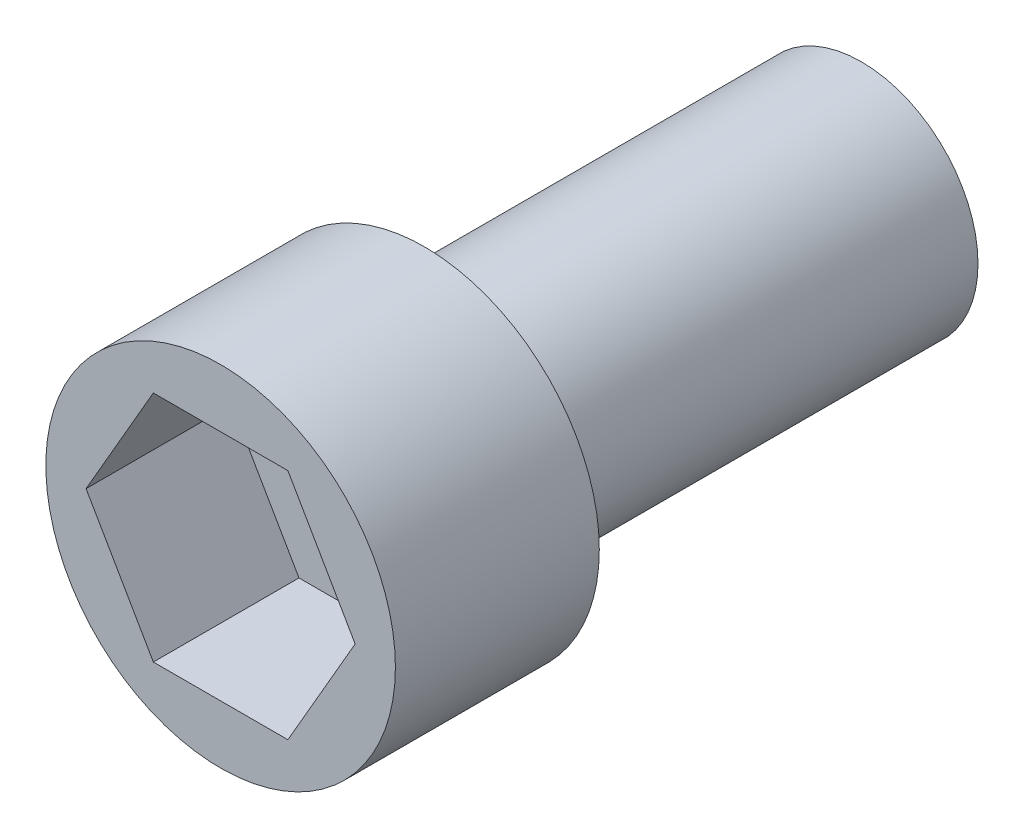
ISO-10303-21;
HEADER;
FILE_DESCRIPTION(('STEP AP214'),'2;1');
FILE_NAME('part.step','',(''),(''),'','','');
FILE_SCHEMA(('AUTOMOTIVE_DESIGN { 1 0 10303 214 1 1 1 1 }'));
ENDSEC;
DATA;
#1=APPLICATION_CONTEXT('core data for automotive mechanical design processes');
#2=APPLICATION_PROTOCOL_DEFINITION('international standard','automotive_design',2000,#1);
#3=PRODUCT_CONTEXT('',#1,'mechanical');
#4=PRODUCT('Part','Part','',(#3));
#5=PRODUCT_RELATED_PRODUCT_CATEGORY('part','',(#4));
#6=PRODUCT_DEFINITION_FORMATION('','',#4);
#7=PRODUCT_DEFINITION_CONTEXT('part definition',#1,'design');
#8=PRODUCT_DEFINITION('design','',#6,#7);
#9=PRODUCT_DEFINITION_SHAPE('','',#8);
#10=(LENGTH_UNIT() NAMED_UNIT(*) SI_UNIT(.MILLI.,.METRE.));
#11=(NAMED_UNIT(*) PLANE_ANGLE_UNIT() SI_UNIT($,.RADIAN.));
#12=(NAMED_UNIT(*) SI_UNIT($,.STERADIAN.) SOLID_ANGLE_UNIT());
#13=UNCERTAINTY_MEASURE_WITH_UNIT(LENGTH_MEASURE(1.E-05),#10,'distance_accuracy_value','');
#14=(GEOMETRIC_REPRESENTATION_CONTEXT(3) GLOBAL_UNCERTAINTY_ASSIGNED_CONTEXT((#13)) GLOBAL_UNIT_ASSIGNED_CONTEXT((#10,
#11,#12)) REPRESENTATION_CONTEXT('',''));
#15=CARTESIAN_POINT('',(0.,0.,0.));
#16=DIRECTION('',(0.,0.,1.));
#17=DIRECTION('',(1.,0.,0.));
#18=AXIS2_PLACEMENT_3D('',#15,#16,#17);
#19=CARTESIAN_POINT('',(0.,0.,-7.));
#20=DIRECTION('',(0.,0.,1.));
#21=DIRECTION('',(1.,0.,0.));
#22=AXIS2_PLACEMENT_3D('',#19,#20,#21);
#23=CYLINDRICAL_SURFACE('',#22,6.);
#24=CARTESIAN_POINT('',(0.,0.,-7.));
#25=DIRECTION('',(0.,0.,1.));
#26=DIRECTION('',(1.,0.,0.));
#27=AXIS2_PLACEMENT_3D('',#24,#25,#26);
#28=CIRCLE('',#27,6.);
#29=CARTESIAN_POINT('',(6.,0.,-7.));
#30=VERTEX_POINT('',#29);
#31=EDGE_CURVE('E11',#30,#30,#28,.T.);
#32=ORIENTED_EDGE('',*,*,#31,.T.);
#33=EDGE_LOOP('',(#32));
#34=FACE_BOUND('',#33,.T.);
#35=CARTESIAN_POINT('',(0.,0.,0.));
#36=DIRECTION('',(0.,0.,1.));
#37=DIRECTION('',(1.,0.,0.));
#38=AXIS2_PLACEMENT_3D('',#35,#36,#37);
#39=CIRCLE('',#38,6.);
#40=CARTESIAN_POINT('',(6.,0.,0.));
#41=VERTEX_POINT('',#40);
#42=EDGE_CURVE('E41',#41,#41,#39,.T.);
#43=ORIENTED_EDGE('',*,*,#42,.F.);
#44=EDGE_LOOP('',(#43));
#45=FACE_BOUND('',#44,.T.);
#46=ADVANCED_FACE('F38',(#34,#45),#23,.T.);
#47=CARTESIAN_POINT('',(0.,0.,-7.));
#48=DIRECTION('',(0.,0.,1.));
#49=DIRECTION('',(1.,0.,0.));
#50=AXIS2_PLACEMENT_3D('',#47,#48,#49);
#51=PLANE('',#50);
#52=CARTESIAN_POINT('',(0.,0.,-7.));
#53=DIRECTION('',(0.,0.,1.));
#54=DIRECTION('',(1.,0.,0.));
#55=AXIS2_PLACEMENT_3D('',#52,#53,#54);
#56=CIRCLE('',#55,4.);
#57=CARTESIAN_POINT('',(4.,0.,-7.));
#58=VERTEX_POINT('',#57);
#59=EDGE_CURVE('E147',#58,#58,#56,.T.);
#60=ORIENTED_EDGE('',*,*,#59,.T.);
#61=EDGE_LOOP('',(#60));
#62=FACE_BOUND('',#61,.T.);
#63=ORIENTED_EDGE('',*,*,#31,.F.);
#64=EDGE_LOOP('',(#63));
#65=FACE_BOUND('',#64,.T.);
#66=ADVANCED_FACE('F157',(#62,#65),#51,.F.);
#67=CARTESIAN_POINT('',(0.,0.,0.));
#68=DIRECTION('',(0.,0.,1.));
#69=DIRECTION('',(1.,0.,0.));
#70=AXIS2_PLACEMENT_3D('',#67,#68,#69);
#71=PLANE('',#70);
#72=DIRECTION('',(-0.5,0.866025403784438,0.));
#73=VECTOR('',#72,1.);
#74=CARTESIAN_POINT('',(4.61880215351701,0.,0.));
#75=LINE('',#74,#73);
#76=CARTESIAN_POINT('',(4.61880215351701,0.,0.));
#77=VERTEX_POINT('',#76);
#78=CARTESIAN_POINT('',(2.3094010767585,4.,0.));
#79=VERTEX_POINT('',#78);
#80=EDGE_CURVE('E52',#77,#79,#75,.T.);
#81=ORIENTED_EDGE('',*,*,#80,.F.);
#82=DIRECTION('',(0.5,0.866025403784439,0.));
#83=VECTOR('',#82,1.);
#84=CARTESIAN_POINT('',(2.3094010767585,-4.,0.));
#85=LINE('',#84,#83);
#86=CARTESIAN_POINT('',(2.3094010767585,-4.,0.));
#87=VERTEX_POINT('',#86);
#88=EDGE_CURVE('E135',#87,#77,#85,.T.);
#89=ORIENTED_EDGE('',*,*,#88,.F.);
#90=DIRECTION('',(1.,0.,0.));
#91=VECTOR('',#90,1.);
#92=CARTESIAN_POINT('',(-2.3094010767585,-4.,0.));
#93=LINE('',#92,#91);
#94=CARTESIAN_POINT('',(-2.3094010767585,-4.,0.));
#95=VERTEX_POINT('',#94);
#96=EDGE_CURVE('E133',#95,#87,#93,.T.);
#97=ORIENTED_EDGE('',*,*,#96,.F.);
#98=DIRECTION('',(0.5,-0.866025403784438,0.));
#99=VECTOR('',#98,1.);
#100=CARTESIAN_POINT('',(-4.61880215351701,0.,0.));
#101=LINE('',#100,#99);
#102=CARTESIAN_POINT('',(-4.61880215351701,0.,0.));
#103=VERTEX_POINT('',#102);
#104=EDGE_CURVE('E100',#103,#95,#101,.T.);
#105=ORIENTED_EDGE('',*,*,#104,.F.);
#106=DIRECTION('',(-0.5,-0.866025403784439,0.));
#107=VECTOR('',#106,1.);
#108=CARTESIAN_POINT('',(-2.3094010767585,4.,0.));
#109=LINE('',#108,#107);
#110=CARTESIAN_POINT('',(-2.3094010767585,4.,0.));
#111=VERTEX_POINT('',#110);
#112=EDGE_CURVE('E129',#111,#103,#109,.T.);
#113=ORIENTED_EDGE('',*,*,#112,.F.);
#114=DIRECTION('',(-1.,0.,0.));
#115=VECTOR('',#114,1.);
#116=CARTESIAN_POINT('',(2.3094010767585,4.,0.));
#117=LINE('',#116,#115);
#118=EDGE_CURVE('E126',#79,#111,#117,.T.);
#119=ORIENTED_EDGE('',*,*,#118,.F.);
#120=EDGE_LOOP('',(#81,#89,#97,#105,#113,#119));
#121=FACE_BOUND('',#120,.T.);
#122=ORIENTED_EDGE('',*,*,#42,.T.);
#123=EDGE_LOOP('',(#122));
#124=FACE_BOUND('',#123,.T.);
#125=ADVANCED_FACE('F154',(#121,#124),#71,.T.);
#126=CARTESIAN_POINT('',(0.,0.,-22.));
#127=DIRECTION('',(0.,0.,1.));
#128=DIRECTION('',(1.,0.,0.));
#129=AXIS2_PLACEMENT_3D('',#126,#127,#128);
#130=CYLINDRICAL_SURFACE('',#129,4.);
#131=CARTESIAN_POINT('',(0.,0.,-22.));
#132=DIRECTION('',(0.,0.,1.));
#133=DIRECTION('',(1.,0.,0.));
#134=AXIS2_PLACEMENT_3D('',#131,#132,#133);
#135=CIRCLE('',#134,4.);
#136=CARTESIAN_POINT('',(4.,0.,-22.));
#137=VERTEX_POINT('',#136);
#138=EDGE_CURVE('E139',#137,#137,#135,.T.);
#139=ORIENTED_EDGE('',*,*,#138,.T.);
#140=EDGE_LOOP('',(#139));
#141=FACE_BOUND('',#140,.T.);
#142=ORIENTED_EDGE('',*,*,#59,.F.);
#143=EDGE_LOOP('',(#142));
#144=FACE_BOUND('',#143,.T.);
#145=ADVANCED_FACE('F169',(#141,#144),#130,.T.);
#146=CARTESIAN_POINT('',(0.,0.,-22.));
#147=DIRECTION('',(0.,0.,1.));
#148=DIRECTION('',(1.,0.,0.));
#149=AXIS2_PLACEMENT_3D('',#146,#147,#148);
#150=PLANE('',#149);
#151=ORIENTED_EDGE('',*,*,#138,.F.);
#152=EDGE_LOOP('',(#151));
#153=FACE_BOUND('',#152,.T.);
#154=ADVANCED_FACE('F173',(#153),#150,.F.);
#155=CARTESIAN_POINT('',(4.61880215351701,0.,-5.));
#156=DIRECTION('',(0.866025403784438,0.5,0.));
#157=DIRECTION('',(-0.5,0.866025403784439,0.));
#158=AXIS2_PLACEMENT_3D('',#155,#156,#157);
#159=PLANE('',#158);
#160=ORIENTED_EDGE('',*,*,#80,.T.);
#161=DIRECTION('',(0.,0.,1.));
#162=VECTOR('',#161,1.);
#163=CARTESIAN_POINT('',(2.3094010767585,4.,-5.));
#164=LINE('',#163,#162);
#165=CARTESIAN_POINT('',(2.3094010767585,4.,-5.));
#166=VERTEX_POINT('',#165);
#167=EDGE_CURVE('E82',#166,#79,#164,.T.);
#168=ORIENTED_EDGE('',*,*,#167,.F.);
#169=DIRECTION('',(-0.5,0.866025403784438,0.));
#170=VECTOR('',#169,1.);
#171=CARTESIAN_POINT('',(4.61880215351701,0.,-5.));
#172=LINE('',#171,#170);
#173=CARTESIAN_POINT('',(4.61880215351701,0.,-5.));
#174=VERTEX_POINT('',#173);
#175=EDGE_CURVE('E137',#174,#166,#172,.T.);
#176=ORIENTED_EDGE('',*,*,#175,.F.);
#177=DIRECTION('',(0.,0.,1.));
#178=VECTOR('',#177,1.);
#179=CARTESIAN_POINT('',(4.61880215351701,0.,-5.));
#180=LINE('',#179,#178);
#181=EDGE_CURVE('E60',#174,#77,#180,.T.);
#182=ORIENTED_EDGE('',*,*,#181,.T.);
#183=EDGE_LOOP('',(#160,#168,#176,#182));
#184=FACE_BOUND('',#183,.T.);
#185=ADVANCED_FACE('F177',(#184),#159,.F.);
#186=CARTESIAN_POINT('',(2.3094010767585,-4.,-5.));
#187=DIRECTION('',(0.866025403784439,-0.5,0.));
#188=DIRECTION('',(0.5,0.866025403784439,0.));
#189=AXIS2_PLACEMENT_3D('',#186,#187,#188);
#190=PLANE('',#189);
#191=ORIENTED_EDGE('',*,*,#88,.T.);
#192=ORIENTED_EDGE('',*,*,#181,.F.);
#193=DIRECTION('',(0.5,0.866025403784439,0.));
#194=VECTOR('',#193,1.);
#195=CARTESIAN_POINT('',(2.3094010767585,-4.,-5.));
#196=LINE('',#195,#194);
#197=CARTESIAN_POINT('',(2.3094010767585,-4.,-5.));
#198=VERTEX_POINT('',#197);
#199=EDGE_CURVE('E112',#198,#174,#196,.T.);
#200=ORIENTED_EDGE('',*,*,#199,.F.);
#201=DIRECTION('',(0.,0.,1.));
#202=VECTOR('',#201,1.);
#203=CARTESIAN_POINT('',(2.3094010767585,-4.,-5.));
#204=LINE('',#203,#202);
#205=EDGE_CURVE('E104',#198,#87,#204,.T.);
#206=ORIENTED_EDGE('',*,*,#205,.T.);
#207=EDGE_LOOP('',(#191,#192,#200,#206));
#208=FACE_BOUND('',#207,.T.);
#209=ADVANCED_FACE('F181',(#208),#190,.F.);
#210=CARTESIAN_POINT('',(-2.3094010767585,-4.,-5.));
#211=DIRECTION('',(0.,-1.,0.));
#212=DIRECTION('',(1.,0.,0.));
#213=AXIS2_PLACEMENT_3D('',#210,#211,#212);
#214=PLANE('',#213);
#215=ORIENTED_EDGE('',*,*,#96,.T.);
#216=ORIENTED_EDGE('',*,*,#205,.F.);
#217=DIRECTION('',(1.,0.,0.));
#218=VECTOR('',#217,1.);
#219=CARTESIAN_POINT('',(-2.3094010767585,-4.,-5.));
#220=LINE('',#219,#218);
#221=CARTESIAN_POINT('',(-2.3094010767585,-4.,-5.));
#222=VERTEX_POINT('',#221);
#223=EDGE_CURVE('E108',#222,#198,#220,.T.);
#224=ORIENTED_EDGE('',*,*,#223,.F.);
#225=DIRECTION('',(0.,0.,1.));
#226=VECTOR('',#225,1.);
#227=CARTESIAN_POINT('',(-2.3094010767585,-4.,-5.));
#228=LINE('',#227,#226);
#229=EDGE_CURVE('E93',#222,#95,#228,.T.);
#230=ORIENTED_EDGE('',*,*,#229,.T.);
#231=EDGE_LOOP('',(#215,#216,#224,#230));
#232=FACE_BOUND('',#231,.T.);
#233=ADVANCED_FACE('F109',(#232),#214,.F.);
#234=CARTESIAN_POINT('',(-4.61880215351701,0.,-5.));
#235=DIRECTION('',(-0.866025403784438,-0.5,0.));
#236=DIRECTION('',(0.5,-0.866025403784438,0.));
#237=AXIS2_PLACEMENT_3D('',#234,#235,#236);
#238=PLANE('',#237);
#239=ORIENTED_EDGE('',*,*,#104,.T.);
#240=ORIENTED_EDGE('',*,*,#229,.F.);
#241=DIRECTION('',(0.5,-0.866025403784438,0.));
#242=VECTOR('',#241,1.);
#243=CARTESIAN_POINT('',(-4.61880215351701,0.,-5.));
#244=LINE('',#243,#242);
#245=CARTESIAN_POINT('',(-4.61880215351701,0.,-5.));
#246=VERTEX_POINT('',#245);
#247=EDGE_CURVE('E97',#246,#222,#244,.T.);
#248=ORIENTED_EDGE('',*,*,#247,.F.);
#249=DIRECTION('',(0.,0.,1.));
#250=VECTOR('',#249,1.);
#251=CARTESIAN_POINT('',(-4.61880215351701,0.,-5.));
#252=LINE('',#251,#250);
#253=EDGE_CURVE('E105',#246,#103,#252,.T.);
#254=ORIENTED_EDGE('',*,*,#253,.T.);
#255=EDGE_LOOP('',(#239,#240,#248,#254));
#256=FACE_BOUND('',#255,.T.);
#257=ADVANCED_FACE('F95',(#256),#238,.F.);
#258=CARTESIAN_POINT('',(-2.3094010767585,4.,-5.));
#259=DIRECTION('',(-0.866025403784438,0.5,0.));
#260=DIRECTION('',(-0.5,-0.866025403784439,0.));
#261=AXIS2_PLACEMENT_3D('',#258,#259,#260);
#262=PLANE('',#261);
#263=ORIENTED_EDGE('',*,*,#112,.T.);
#264=ORIENTED_EDGE('',*,*,#253,.F.);
#265=DIRECTION('',(-0.5,-0.866025403784439,0.));
#266=VECTOR('',#265,1.);
#267=CARTESIAN_POINT('',(-2.3094010767585,4.,-5.));
#268=LINE('',#267,#266);
#269=CARTESIAN_POINT('',(-2.3094010767585,4.,-5.));
#270=VERTEX_POINT('',#269);
#271=EDGE_CURVE('E118',#270,#246,#268,.T.);
#272=ORIENTED_EDGE('',*,*,#271,.F.);
#273=DIRECTION('',(0.,0.,1.));
#274=VECTOR('',#273,1.);
#275=CARTESIAN_POINT('',(-2.3094010767585,4.,-5.));
#276=LINE('',#275,#274);
#277=EDGE_CURVE('E142',#270,#111,#276,.T.);
#278=ORIENTED_EDGE('',*,*,#277,.T.);
#279=EDGE_LOOP('',(#263,#264,#272,#278));
#280=FACE_BOUND('',#279,.T.);
#281=ADVANCED_FACE('F185',(#280),#262,.F.);
#282=CARTESIAN_POINT('',(2.3094010767585,4.,-5.));
#283=DIRECTION('',(0.,1.,0.));
#284=DIRECTION('',(0.,0.,1.));
#285=AXIS2_PLACEMENT_3D('',#282,#283,#284);
#286=PLANE('',#285);
#287=ORIENTED_EDGE('',*,*,#118,.T.);
#288=ORIENTED_EDGE('',*,*,#277,.F.);
#289=DIRECTION('',(-1.,0.,0.));
#290=VECTOR('',#289,1.);
#291=CARTESIAN_POINT('',(2.3094010767585,4.,-5.));
#292=LINE('',#291,#290);
#293=EDGE_CURVE('E120',#166,#270,#292,.T.);
#294=ORIENTED_EDGE('',*,*,#293,.F.);
#295=ORIENTED_EDGE('',*,*,#167,.T.);
#296=EDGE_LOOP('',(#287,#288,#294,#295));
#297=FACE_BOUND('',#296,.T.);
#298=ADVANCED_FACE('F182',(#297),#286,.F.);
#299=CARTESIAN_POINT('',(0.,0.,-5.));
#300=DIRECTION('',(0.,0.,1.));
#301=DIRECTION('',(1.,0.,0.));
#302=AXIS2_PLACEMENT_3D('',#299,#300,#301);
#303=PLANE('',#302);
#304=ORIENTED_EDGE('',*,*,#175,.T.);
#305=ORIENTED_EDGE('',*,*,#293,.T.);
#306=ORIENTED_EDGE('',*,*,#271,.T.);
#307=ORIENTED_EDGE('',*,*,#247,.T.);
#308=ORIENTED_EDGE('',*,*,#223,.T.);
#309=ORIENTED_EDGE('',*,*,#199,.T.);
#310=EDGE_LOOP('',(#304,#305,#306,#307,#308,#309));
#311=FACE_BOUND('',#310,.T.);
#312=ADVANCED_FACE('F115',(#311),#303,.T.);
#313=CLOSED_SHELL('',(#46,#66,#125,#145,#154,#185,#209,#233,#257,#281,#298,#312));
#314=MANIFOLD_SOLID_BREP('B2',#313);
#315=ADVANCED_BREP_SHAPE_REPRESENTATION('',(#18,#314),#14);
#316=SHAPE_DEFINITION_REPRESENTATION(#9,#315);
ENDSEC;
END-ISO-10303-21;
